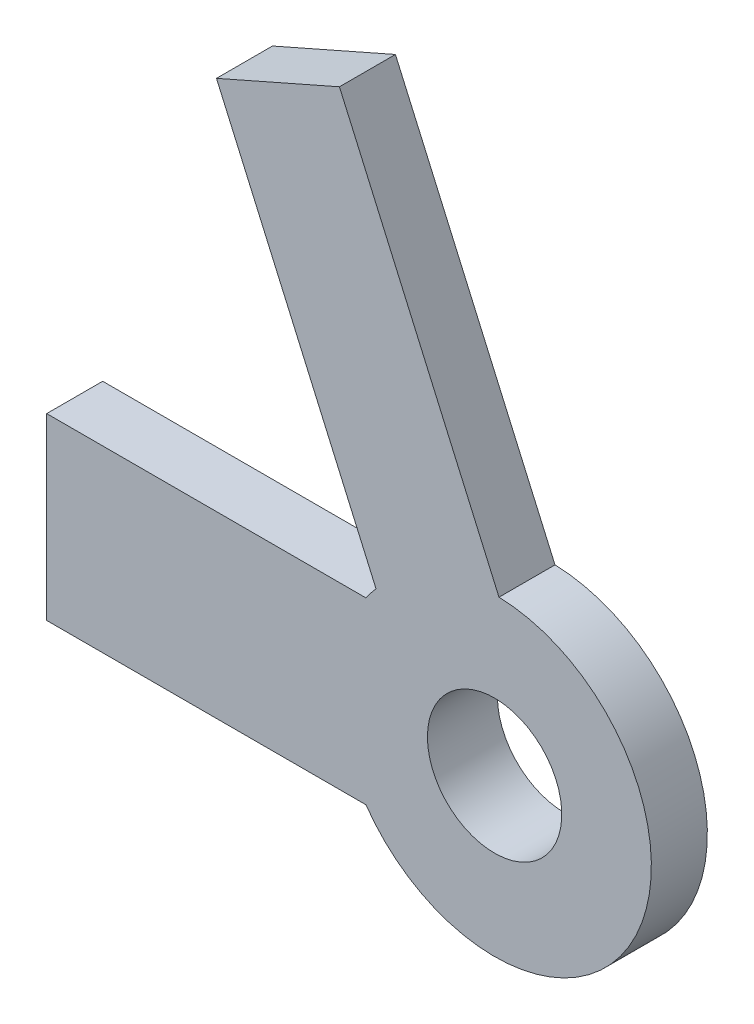
ISO-10303-21;
HEADER;
FILE_DESCRIPTION(('STEP AP214'),'2;1');
FILE_NAME('part.step','',(''),(''),'','','');
FILE_SCHEMA(('AUTOMOTIVE_DESIGN { 1 0 10303 214 1 1 1 1 }'));
ENDSEC;
DATA;
#1=APPLICATION_CONTEXT('core data for automotive mechanical design processes');
#2=APPLICATION_PROTOCOL_DEFINITION('international standard','automotive_design',2000,#1);
#3=PRODUCT_CONTEXT('',#1,'mechanical');
#4=PRODUCT('Part','Part','',(#3));
#5=PRODUCT_RELATED_PRODUCT_CATEGORY('part','',(#4));
#6=PRODUCT_DEFINITION_FORMATION('','',#4);
#7=PRODUCT_DEFINITION_CONTEXT('part definition',#1,'design');
#8=PRODUCT_DEFINITION('design','',#6,#7);
#9=PRODUCT_DEFINITION_SHAPE('','',#8);
#10=(LENGTH_UNIT() NAMED_UNIT(*) SI_UNIT(.MILLI.,.METRE.));
#11=(NAMED_UNIT(*) PLANE_ANGLE_UNIT() SI_UNIT($,.RADIAN.));
#12=(NAMED_UNIT(*) SI_UNIT($,.STERADIAN.) SOLID_ANGLE_UNIT());
#13=UNCERTAINTY_MEASURE_WITH_UNIT(LENGTH_MEASURE(1.E-05),#10,'distance_accuracy_value','');
#14=(GEOMETRIC_REPRESENTATION_CONTEXT(3) GLOBAL_UNCERTAINTY_ASSIGNED_CONTEXT((#13)) GLOBAL_UNIT_ASSIGNED_CONTEXT((#10,
#11,#12)) REPRESENTATION_CONTEXT('',''));
#15=CARTESIAN_POINT('',(0.,0.,0.));
#16=DIRECTION('',(0.,0.,1.));
#17=DIRECTION('',(1.,0.,0.));
#18=AXIS2_PLACEMENT_3D('',#15,#16,#17);
#19=CARTESIAN_POINT('',(0.,0.,2.5));
#20=DIRECTION('',(0.,0.,-1.));
#21=DIRECTION('',(-1.,0.,0.));
#22=AXIS2_PLACEMENT_3D('',#19,#20,#21);
#23=CYLINDRICAL_SURFACE('',#22,14.);
#24=CARTESIAN_POINT('',(0.,0.,-2.5));
#25=DIRECTION('',(0.,0.,1.));
#26=DIRECTION('',(1.,0.,0.));
#27=AXIS2_PLACEMENT_3D('',#24,#25,#26);
#28=CIRCLE('',#27,14.);
#29=CARTESIAN_POINT('',(-11.4891252930761,-8.,-2.5));
#30=VERTEX_POINT('',#29);
#31=CARTESIAN_POINT('',(0.392596458525813,13.9944942038201,-2.5));
#32=VERTEX_POINT('',#31);
#33=EDGE_CURVE('E146',#30,#32,#28,.T.);
#34=ORIENTED_EDGE('',*,*,#33,.T.);
#35=DIRECTION('',(0.,0.,-1.));
#36=VECTOR('',#35,1.);
#37=CARTESIAN_POINT('',(0.392596458525813,13.9944942038201,2.5));
#38=LINE('',#37,#36);
#39=CARTESIAN_POINT('',(0.392596458525813,13.9944942038201,2.5));
#40=VERTEX_POINT('',#39);
#41=EDGE_CURVE('E51',#40,#32,#38,.T.);
#42=ORIENTED_EDGE('',*,*,#41,.F.);
#43=CARTESIAN_POINT('',(0.,0.,2.5));
#44=DIRECTION('',(0.,0.,1.));
#45=DIRECTION('',(1.,0.,0.));
#46=AXIS2_PLACEMENT_3D('',#43,#44,#45);
#47=CIRCLE('',#46,14.);
#48=CARTESIAN_POINT('',(-11.4891252930761,-8.,2.5));
#49=VERTEX_POINT('',#48);
#50=EDGE_CURVE('E99',#49,#40,#47,.T.);
#51=ORIENTED_EDGE('',*,*,#50,.F.);
#52=DIRECTION('',(0.,0.,-1.));
#53=VECTOR('',#52,1.);
#54=CARTESIAN_POINT('',(-11.4891252930761,-8.,2.5));
#55=LINE('',#54,#53);
#56=EDGE_CURVE('E145',#49,#30,#55,.T.);
#57=ORIENTED_EDGE('',*,*,#56,.T.);
#58=EDGE_LOOP('',(#34,#42,#51,#57));
#59=FACE_BOUND('',#58,.T.);
#60=ADVANCED_FACE('F41',(#59),#23,.T.);
#61=CARTESIAN_POINT('',(5.49102502945526,2.41839701577216,2.5));
#62=DIRECTION('',(0.915170838242546,0.40306616929536,0.));
#63=DIRECTION('',(-0.40306616929536,0.915170838242546,0.));
#64=AXIS2_PLACEMENT_3D('',#61,#62,#63);
#65=PLANE('',#64);
#66=DIRECTION('',(0.40306616929536,-0.915170838242546,0.));
#67=VECTOR('',#66,1.);
#68=CARTESIAN_POINT('',(5.49102502945526,2.41839701577216,-2.5));
#69=LINE('',#68,#67);
#70=CARTESIAN_POINT('',(-13.856151096722,46.3465972514144,-2.5));
#71=VERTEX_POINT('',#70);
#72=EDGE_CURVE('E150',#71,#32,#69,.T.);
#73=ORIENTED_EDGE('',*,*,#72,.F.);
#74=DIRECTION('',(0.,0.,-1.));
#75=VECTOR('',#74,1.);
#76=CARTESIAN_POINT('',(-13.856151096722,46.3465972514144,2.5));
#77=LINE('',#76,#75);
#78=CARTESIAN_POINT('',(-13.856151096722,46.3465972514144,2.5));
#79=VERTEX_POINT('',#78);
#80=EDGE_CURVE('E182',#79,#71,#77,.T.);
#81=ORIENTED_EDGE('',*,*,#80,.F.);
#82=DIRECTION('',(0.40306616929536,-0.915170838242546,0.));
#83=VECTOR('',#82,1.);
#84=CARTESIAN_POINT('',(5.49102502945526,2.41839701577216,2.5));
#85=LINE('',#84,#83);
#86=EDGE_CURVE('E188',#79,#40,#85,.T.);
#87=ORIENTED_EDGE('',*,*,#86,.T.);
#88=ORIENTED_EDGE('',*,*,#41,.T.);
#89=EDGE_LOOP('',(#73,#81,#87,#88));
#90=FACE_BOUND('',#89,.T.);
#91=ADVANCED_FACE('F43',(#90),#65,.T.);
#92=CARTESIAN_POINT('',(-19.3471761261773,43.9282002356422,2.5));
#93=DIRECTION('',(-0.40306616929536,0.915170838242546,0.));
#94=DIRECTION('',(-0.915170838242546,-0.40306616929536,0.));
#95=AXIS2_PLACEMENT_3D('',#92,#93,#94);
#96=PLANE('',#95);
#97=DIRECTION('',(0.915170838242546,0.40306616929536,0.));
#98=VECTOR('',#97,1.);
#99=CARTESIAN_POINT('',(-19.3471761261773,43.9282002356422,-2.5));
#100=LINE('',#99,#98);
#101=CARTESIAN_POINT('',(-24.8382011556326,41.50980321987,-2.5));
#102=VERTEX_POINT('',#101);
#103=EDGE_CURVE('E156',#102,#71,#100,.T.);
#104=ORIENTED_EDGE('',*,*,#103,.F.);
#105=DIRECTION('',(0.,0.,-1.));
#106=VECTOR('',#105,1.);
#107=CARTESIAN_POINT('',(-24.8382011556326,41.50980321987,2.5));
#108=LINE('',#107,#106);
#109=CARTESIAN_POINT('',(-24.8382011556326,41.50980321987,2.5));
#110=VERTEX_POINT('',#109);
#111=EDGE_CURVE('E179',#110,#102,#108,.T.);
#112=ORIENTED_EDGE('',*,*,#111,.F.);
#113=DIRECTION('',(0.915170838242546,0.40306616929536,0.));
#114=VECTOR('',#113,1.);
#115=CARTESIAN_POINT('',(-19.3471761261773,43.9282002356422,2.5));
#116=LINE('',#115,#114);
#117=EDGE_CURVE('E201',#110,#79,#116,.T.);
#118=ORIENTED_EDGE('',*,*,#117,.T.);
#119=ORIENTED_EDGE('',*,*,#80,.T.);
#120=EDGE_LOOP('',(#104,#112,#118,#119));
#121=FACE_BOUND('',#120,.T.);
#122=ADVANCED_FACE('F197',(#121),#96,.T.);
#123=CARTESIAN_POINT('',(-5.49102502945528,-2.41839701577216,2.5));
#124=DIRECTION('',(0.915170838242546,0.40306616929536,0.));
#125=DIRECTION('',(-0.40306616929536,0.915170838242546,0.));
#126=AXIS2_PLACEMENT_3D('',#123,#124,#125);
#127=PLANE('',#126);
#128=DIRECTION('',(0.40306616929536,-0.915170838242546,0.));
#129=VECTOR('',#128,1.);
#130=CARTESIAN_POINT('',(-5.49102502945528,-2.41839701577216,-2.5));
#131=LINE('',#130,#129);
#132=CARTESIAN_POINT('',(-10.5894536003847,9.15770017227573,-2.5));
#133=VERTEX_POINT('',#132);
#134=EDGE_CURVE('E160',#102,#133,#131,.T.);
#135=ORIENTED_EDGE('',*,*,#134,.T.);
#136=DIRECTION('',(0.,0.,-1.));
#137=VECTOR('',#136,1.);
#138=CARTESIAN_POINT('',(-10.5894536003847,9.15770017227573,2.5));
#139=LINE('',#138,#137);
#140=CARTESIAN_POINT('',(-10.5894536003847,9.15770017227573,2.5));
#141=VERTEX_POINT('',#140);
#142=EDGE_CURVE('E175',#141,#133,#139,.T.);
#143=ORIENTED_EDGE('',*,*,#142,.F.);
#144=DIRECTION('',(0.40306616929536,-0.915170838242546,0.));
#145=VECTOR('',#144,1.);
#146=CARTESIAN_POINT('',(-5.49102502945528,-2.41839701577216,2.5));
#147=LINE('',#146,#145);
#148=EDGE_CURVE('E138',#110,#141,#147,.T.);
#149=ORIENTED_EDGE('',*,*,#148,.F.);
#150=ORIENTED_EDGE('',*,*,#111,.T.);
#151=EDGE_LOOP('',(#135,#143,#149,#150));
#152=FACE_BOUND('',#151,.T.);
#153=ADVANCED_FACE('F255',(#152),#127,.F.);
#154=CARTESIAN_POINT('',(-11.4891252930761,8.,-2.5));
#155=VERTEX_POINT('',#154);
#156=EDGE_CURVE('E152',#133,#155,#28,.T.);
#157=ORIENTED_EDGE('',*,*,#156,.T.);
#158=DIRECTION('',(0.,0.,-1.));
#159=VECTOR('',#158,1.);
#160=CARTESIAN_POINT('',(-11.4891252930761,8.,2.5));
#161=LINE('',#160,#159);
#162=CARTESIAN_POINT('',(-11.4891252930761,8.,2.5));
#163=VERTEX_POINT('',#162);
#164=EDGE_CURVE('E124',#163,#155,#161,.T.);
#165=ORIENTED_EDGE('',*,*,#164,.F.);
#166=EDGE_CURVE('E133',#141,#163,#47,.T.);
#167=ORIENTED_EDGE('',*,*,#166,.F.);
#168=ORIENTED_EDGE('',*,*,#142,.T.);
#169=EDGE_LOOP('',(#157,#165,#167,#168));
#170=FACE_BOUND('',#169,.T.);
#171=ADVANCED_FACE('F248',(#170),#23,.T.);
#172=CARTESIAN_POINT('',(0.,8.,2.5));
#173=DIRECTION('',(0.,1.,0.));
#174=DIRECTION('',(-1.,0.,0.));
#175=AXIS2_PLACEMENT_3D('',#172,#173,#174);
#176=PLANE('',#175);
#177=DIRECTION('',(1.,0.,0.));
#178=VECTOR('',#177,1.);
#179=CARTESIAN_POINT('',(0.,8.,-2.5));
#180=LINE('',#179,#178);
#181=CARTESIAN_POINT('',(-40.,8.,-2.5));
#182=VERTEX_POINT('',#181);
#183=EDGE_CURVE('E122',#182,#155,#180,.T.);
#184=ORIENTED_EDGE('',*,*,#183,.F.);
#185=DIRECTION('',(0.,0.,-1.));
#186=VECTOR('',#185,1.);
#187=CARTESIAN_POINT('',(-40.,8.,2.5));
#188=LINE('',#187,#186);
#189=CARTESIAN_POINT('',(-40.,8.,2.5));
#190=VERTEX_POINT('',#189);
#191=EDGE_CURVE('E116',#190,#182,#188,.T.);
#192=ORIENTED_EDGE('',*,*,#191,.F.);
#193=DIRECTION('',(1.,0.,0.));
#194=VECTOR('',#193,1.);
#195=CARTESIAN_POINT('',(0.,8.,2.5));
#196=LINE('',#195,#194);
#197=EDGE_CURVE('E120',#190,#163,#196,.T.);
#198=ORIENTED_EDGE('',*,*,#197,.T.);
#199=ORIENTED_EDGE('',*,*,#164,.T.);
#200=EDGE_LOOP('',(#184,#192,#198,#199));
#201=FACE_BOUND('',#200,.T.);
#202=ADVANCED_FACE('F118',(#201),#176,.T.);
#203=CARTESIAN_POINT('',(-40.,0.,2.5));
#204=DIRECTION('',(1.,0.,0.));
#205=DIRECTION('',(0.,0.,-1.));
#206=AXIS2_PLACEMENT_3D('',#203,#204,#205);
#207=PLANE('',#206);
#208=DIRECTION('',(0.,-1.,0.));
#209=VECTOR('',#208,1.);
#210=CARTESIAN_POINT('',(-40.,0.,-2.5));
#211=LINE('',#210,#209);
#212=CARTESIAN_POINT('',(-40.,-8.,-2.5));
#213=VERTEX_POINT('',#212);
#214=EDGE_CURVE('E87',#182,#213,#211,.T.);
#215=ORIENTED_EDGE('',*,*,#214,.T.);
#216=DIRECTION('',(0.,0.,-1.));
#217=VECTOR('',#216,1.);
#218=CARTESIAN_POINT('',(-40.,-8.,2.5));
#219=LINE('',#218,#217);
#220=CARTESIAN_POINT('',(-40.,-8.,2.5));
#221=VERTEX_POINT('',#220);
#222=EDGE_CURVE('E125',#221,#213,#219,.T.);
#223=ORIENTED_EDGE('',*,*,#222,.F.);
#224=DIRECTION('',(0.,-1.,0.));
#225=VECTOR('',#224,1.);
#226=CARTESIAN_POINT('',(-40.,0.,2.5));
#227=LINE('',#226,#225);
#228=EDGE_CURVE('E127',#190,#221,#227,.T.);
#229=ORIENTED_EDGE('',*,*,#228,.F.);
#230=ORIENTED_EDGE('',*,*,#191,.T.);
#231=EDGE_LOOP('',(#215,#223,#229,#230));
#232=FACE_BOUND('',#231,.T.);
#233=ADVANCED_FACE('F128',(#232),#207,.F.);
#234=CARTESIAN_POINT('',(0.,-8.,2.5));
#235=DIRECTION('',(0.,1.,0.));
#236=DIRECTION('',(-1.,0.,0.));
#237=AXIS2_PLACEMENT_3D('',#234,#235,#236);
#238=PLANE('',#237);
#239=DIRECTION('',(1.,0.,0.));
#240=VECTOR('',#239,1.);
#241=CARTESIAN_POINT('',(0.,-8.,-2.5));
#242=LINE('',#241,#240);
#243=EDGE_CURVE('E93',#213,#30,#242,.T.);
#244=ORIENTED_EDGE('',*,*,#243,.T.);
#245=ORIENTED_EDGE('',*,*,#56,.F.);
#246=DIRECTION('',(1.,0.,0.));
#247=VECTOR('',#246,1.);
#248=CARTESIAN_POINT('',(0.,-8.,2.5));
#249=LINE('',#248,#247);
#250=EDGE_CURVE('E59',#221,#49,#249,.T.);
#251=ORIENTED_EDGE('',*,*,#250,.F.);
#252=ORIENTED_EDGE('',*,*,#222,.T.);
#253=EDGE_LOOP('',(#244,#245,#251,#252));
#254=FACE_BOUND('',#253,.T.);
#255=ADVANCED_FACE('F243',(#254),#238,.F.);
#256=CARTESIAN_POINT('',(0.,0.,2.5));
#257=DIRECTION('',(0.,0.,1.));
#258=DIRECTION('',(1.,0.,0.));
#259=AXIS2_PLACEMENT_3D('',#256,#257,#258);
#260=PLANE('',#259);
#261=CARTESIAN_POINT('',(0.,0.,2.5));
#262=DIRECTION('',(0.,0.,-1.));
#263=DIRECTION('',(-1.,0.,0.));
#264=AXIS2_PLACEMENT_3D('',#261,#262,#263);
#265=CIRCLE('',#264,6.);
#266=CARTESIAN_POINT('',(-6.,0.,2.5));
#267=VERTEX_POINT('',#266);
#268=EDGE_CURVE('E210',#267,#267,#265,.T.);
#269=ORIENTED_EDGE('',*,*,#268,.T.);
#270=EDGE_LOOP('',(#269));
#271=FACE_BOUND('',#270,.T.);
#272=ORIENTED_EDGE('',*,*,#50,.T.);
#273=ORIENTED_EDGE('',*,*,#86,.F.);
#274=ORIENTED_EDGE('',*,*,#117,.F.);
#275=ORIENTED_EDGE('',*,*,#148,.T.);
#276=ORIENTED_EDGE('',*,*,#166,.T.);
#277=ORIENTED_EDGE('',*,*,#197,.F.);
#278=ORIENTED_EDGE('',*,*,#228,.T.);
#279=ORIENTED_EDGE('',*,*,#250,.T.);
#280=EDGE_LOOP('',(#272,#273,#274,#275,#276,#277,#278,#279));
#281=FACE_BOUND('',#280,.T.);
#282=ADVANCED_FACE('F131',(#271,#281),#260,.T.);
#283=CARTESIAN_POINT('',(0.,0.,-2.5));
#284=DIRECTION('',(0.,0.,1.));
#285=DIRECTION('',(1.,0.,0.));
#286=AXIS2_PLACEMENT_3D('',#283,#284,#285);
#287=PLANE('',#286);
#288=CARTESIAN_POINT('',(0.,0.,-2.5));
#289=DIRECTION('',(0.,0.,1.));
#290=DIRECTION('',(1.,0.,0.));
#291=AXIS2_PLACEMENT_3D('',#288,#289,#290);
#292=CIRCLE('',#291,10.);
#293=CARTESIAN_POINT('',(10.,0.,-2.5));
#294=VERTEX_POINT('',#293);
#295=EDGE_CURVE('E11',#294,#294,#292,.F.);
#296=ORIENTED_EDGE('',*,*,#295,.F.);
#297=EDGE_LOOP('',(#296));
#298=FACE_BOUND('',#297,.T.);
#299=ORIENTED_EDGE('',*,*,#33,.F.);
#300=ORIENTED_EDGE('',*,*,#243,.F.);
#301=ORIENTED_EDGE('',*,*,#214,.F.);
#302=ORIENTED_EDGE('',*,*,#183,.T.);
#303=ORIENTED_EDGE('',*,*,#156,.F.);
#304=ORIENTED_EDGE('',*,*,#134,.F.);
#305=ORIENTED_EDGE('',*,*,#103,.T.);
#306=ORIENTED_EDGE('',*,*,#72,.T.);
#307=EDGE_LOOP('',(#299,#300,#301,#302,#303,#304,#305,#306));
#308=FACE_BOUND('',#307,.T.);
#309=ADVANCED_FACE('F192',(#298,#308),#287,.F.);
#310=CARTESIAN_POINT('',(0.,0.,-3.75));
#311=DIRECTION('',(0.,0.,1.));
#312=DIRECTION('',(1.,0.,0.));
#313=AXIS2_PLACEMENT_3D('',#310,#311,#312);
#314=CYLINDRICAL_SURFACE('',#313,10.);
#315=CARTESIAN_POINT('',(0.,0.,-3.75));
#316=DIRECTION('',(0.,0.,-1.));
#317=DIRECTION('',(-1.,0.,0.));
#318=AXIS2_PLACEMENT_3D('',#315,#316,#317);
#319=CIRCLE('',#318,10.);
#320=CARTESIAN_POINT('',(-10.,0.,-3.75));
#321=VERTEX_POINT('',#320);
#322=EDGE_CURVE('E151',#321,#321,#319,.T.);
#323=ORIENTED_EDGE('',*,*,#322,.F.);
#324=EDGE_LOOP('',(#323));
#325=FACE_BOUND('',#324,.T.);
#326=ORIENTED_EDGE('',*,*,#295,.T.);
#327=EDGE_LOOP('',(#326));
#328=FACE_BOUND('',#327,.T.);
#329=ADVANCED_FACE('F229',(#325,#328),#314,.T.);
#330=CARTESIAN_POINT('',(0.,0.,-3.75));
#331=DIRECTION('',(0.,0.,-1.));
#332=DIRECTION('',(-1.,0.,0.));
#333=AXIS2_PLACEMENT_3D('',#330,#331,#332);
#334=PLANE('',#333);
#335=CARTESIAN_POINT('',(0.,0.,-3.75));
#336=DIRECTION('',(0.,0.,-1.));
#337=DIRECTION('',(-1.,0.,0.));
#338=AXIS2_PLACEMENT_3D('',#335,#336,#337);
#339=CIRCLE('',#338,6.);
#340=CARTESIAN_POINT('',(-6.,0.,-3.75));
#341=VERTEX_POINT('',#340);
#342=EDGE_CURVE('E211',#341,#341,#339,.T.);
#343=ORIENTED_EDGE('',*,*,#342,.F.);
#344=EDGE_LOOP('',(#343));
#345=FACE_BOUND('',#344,.T.);
#346=ORIENTED_EDGE('',*,*,#322,.T.);
#347=EDGE_LOOP('',(#346));
#348=FACE_BOUND('',#347,.T.);
#349=ADVANCED_FACE('F223',(#345,#348),#334,.T.);
#350=CARTESIAN_POINT('',(0.,0.,2.5));
#351=DIRECTION('',(0.,0.,-1.));
#352=DIRECTION('',(-1.,0.,0.));
#353=AXIS2_PLACEMENT_3D('',#350,#351,#352);
#354=CYLINDRICAL_SURFACE('',#353,6.);
#355=ORIENTED_EDGE('',*,*,#268,.F.);
#356=EDGE_LOOP('',(#355));
#357=FACE_BOUND('',#356,.T.);
#358=ORIENTED_EDGE('',*,*,#342,.T.);
#359=EDGE_LOOP('',(#358));
#360=FACE_BOUND('',#359,.T.);
#361=ADVANCED_FACE('F220',(#357,#360),#354,.F.);
#362=CLOSED_SHELL('',(#60,#91,#122,#153,#171,#202,#233,#255,#282,#309,#329,#349,#361));
#363=MANIFOLD_SOLID_BREP('B2',#362);
#364=ADVANCED_BREP_SHAPE_REPRESENTATION('',(#18,#363),#14);
#365=SHAPE_DEFINITION_REPRESENTATION(#9,#364);
ENDSEC;
END-ISO-10303-21;
